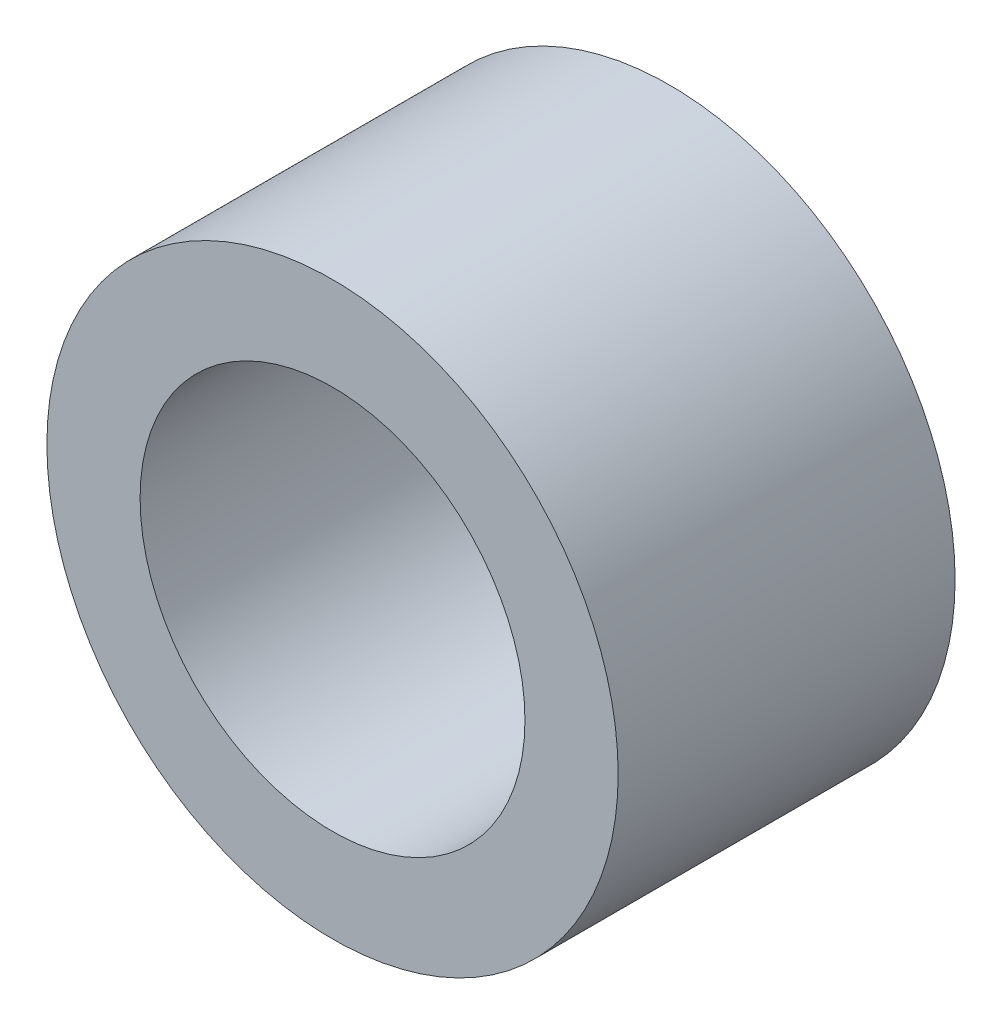
ISO-10303-21;
HEADER;
FILE_DESCRIPTION(('STEP AP214'),'2;1');
FILE_NAME('part.step','',(''),(''),'','','');
FILE_SCHEMA(('AUTOMOTIVE_DESIGN { 1 0 10303 214 1 1 1 1 }'));
ENDSEC;
DATA;
#1=APPLICATION_CONTEXT('core data for automotive mechanical design processes');
#2=APPLICATION_PROTOCOL_DEFINITION('international standard','automotive_design',2000,#1);
#3=PRODUCT_CONTEXT('',#1,'mechanical');
#4=PRODUCT('Part','Part','',(#3));
#5=PRODUCT_RELATED_PRODUCT_CATEGORY('part','',(#4));
#6=PRODUCT_DEFINITION_FORMATION('','',#4);
#7=PRODUCT_DEFINITION_CONTEXT('part definition',#1,'design');
#8=PRODUCT_DEFINITION('design','',#6,#7);
#9=PRODUCT_DEFINITION_SHAPE('','',#8);
#10=(LENGTH_UNIT() NAMED_UNIT(*) SI_UNIT(.MILLI.,.METRE.));
#11=(NAMED_UNIT(*) PLANE_ANGLE_UNIT() SI_UNIT($,.RADIAN.));
#12=(NAMED_UNIT(*) SI_UNIT($,.STERADIAN.) SOLID_ANGLE_UNIT());
#13=UNCERTAINTY_MEASURE_WITH_UNIT(LENGTH_MEASURE(1.E-05),#10,'distance_accuracy_value','');
#14=(GEOMETRIC_REPRESENTATION_CONTEXT(3) GLOBAL_UNCERTAINTY_ASSIGNED_CONTEXT((#13)) GLOBAL_UNIT_ASSIGNED_CONTEXT((#10,
#11,#12)) REPRESENTATION_CONTEXT('',''));
#15=CARTESIAN_POINT('',(0.,0.,0.));
#16=DIRECTION('',(0.,0.,1.));
#17=DIRECTION('',(1.,0.,0.));
#18=AXIS2_PLACEMENT_3D('',#15,#16,#17);
#19=CARTESIAN_POINT('',(0.,0.,6.96));
#20=DIRECTION('',(0.,0.,1.));
#21=DIRECTION('',(1.,0.,0.));
#22=AXIS2_PLACEMENT_3D('',#19,#20,#21);
#23=PLANE('',#22);
#24=CARTESIAN_POINT('',(0.,0.,6.96));
#25=DIRECTION('',(0.,0.,1.));
#26=DIRECTION('',(1.,0.,0.));
#27=AXIS2_PLACEMENT_3D('',#24,#25,#26);
#28=CIRCLE('',#27,5.9);
#29=CARTESIAN_POINT('',(5.9,0.,6.96));
#30=VERTEX_POINT('',#29);
#31=EDGE_CURVE('E10',#30,#30,#28,.T.);
#32=ORIENTED_EDGE('',*,*,#31,.T.);
#33=EDGE_LOOP('',(#32));
#34=FACE_BOUND('',#33,.T.);
#35=CARTESIAN_POINT('',(0.,0.,6.96));
#36=DIRECTION('',(0.,0.,1.));
#37=DIRECTION('',(1.,0.,0.));
#38=AXIS2_PLACEMENT_3D('',#35,#36,#37);
#39=CIRCLE('',#38,3.975);
#40=CARTESIAN_POINT('',(3.975,0.,6.96));
#41=VERTEX_POINT('',#40);
#42=EDGE_CURVE('E46',#41,#41,#39,.T.);
#43=ORIENTED_EDGE('',*,*,#42,.F.);
#44=EDGE_LOOP('',(#43));
#45=FACE_BOUND('',#44,.T.);
#46=ADVANCED_FACE('F35',(#34,#45),#23,.T.);
#47=CARTESIAN_POINT('',(0.,0.,0.));
#48=DIRECTION('',(0.,0.,1.));
#49=DIRECTION('',(1.,0.,0.));
#50=AXIS2_PLACEMENT_3D('',#47,#48,#49);
#51=PLANE('',#50);
#52=CARTESIAN_POINT('',(0.,0.,0.));
#53=DIRECTION('',(0.,0.,1.));
#54=DIRECTION('',(1.,0.,0.));
#55=AXIS2_PLACEMENT_3D('',#52,#53,#54);
#56=CIRCLE('',#55,5.9);
#57=CARTESIAN_POINT('',(5.9,0.,0.));
#58=VERTEX_POINT('',#57);
#59=EDGE_CURVE('E39',#58,#58,#56,.T.);
#60=ORIENTED_EDGE('',*,*,#59,.F.);
#61=EDGE_LOOP('',(#60));
#62=FACE_BOUND('',#61,.T.);
#63=CARTESIAN_POINT('',(0.,0.,0.));
#64=DIRECTION('',(0.,0.,1.));
#65=DIRECTION('',(1.,0.,0.));
#66=AXIS2_PLACEMENT_3D('',#63,#64,#65);
#67=CIRCLE('',#66,3.975);
#68=CARTESIAN_POINT('',(3.975,0.,0.));
#69=VERTEX_POINT('',#68);
#70=EDGE_CURVE('E48',#69,#69,#67,.T.);
#71=ORIENTED_EDGE('',*,*,#70,.T.);
#72=EDGE_LOOP('',(#71));
#73=FACE_BOUND('',#72,.T.);
#74=ADVANCED_FACE('F58',(#62,#73),#51,.F.);
#75=CARTESIAN_POINT('',(0.,0.,6.96));
#76=DIRECTION('',(0.,0.,-1.));
#77=DIRECTION('',(-1.,0.,0.));
#78=AXIS2_PLACEMENT_3D('',#75,#76,#77);
#79=CYLINDRICAL_SURFACE('',#78,5.9);
#80=ORIENTED_EDGE('',*,*,#31,.F.);
#81=EDGE_LOOP('',(#80));
#82=FACE_BOUND('',#81,.T.);
#83=ORIENTED_EDGE('',*,*,#59,.T.);
#84=EDGE_LOOP('',(#83));
#85=FACE_BOUND('',#84,.T.);
#86=ADVANCED_FACE('F37',(#82,#85),#79,.T.);
#87=CARTESIAN_POINT('',(0.,0.,6.96));
#88=DIRECTION('',(0.,0.,-1.));
#89=DIRECTION('',(-1.,0.,0.));
#90=AXIS2_PLACEMENT_3D('',#87,#88,#89);
#91=CYLINDRICAL_SURFACE('',#90,3.975);
#92=ORIENTED_EDGE('',*,*,#42,.T.);
#93=EDGE_LOOP('',(#92));
#94=FACE_BOUND('',#93,.T.);
#95=ORIENTED_EDGE('',*,*,#70,.F.);
#96=EDGE_LOOP('',(#95));
#97=FACE_BOUND('',#96,.T.);
#98=ADVANCED_FACE('F54',(#94,#97),#91,.F.);
#99=CLOSED_SHELL('',(#46,#74,#86,#98));
#100=MANIFOLD_SOLID_BREP('B2',#99);
#101=ADVANCED_BREP_SHAPE_REPRESENTATION('',(#18,#100),#14);
#102=SHAPE_DEFINITION_REPRESENTATION(#9,#101);
ENDSEC;
END-ISO-10303-21;
